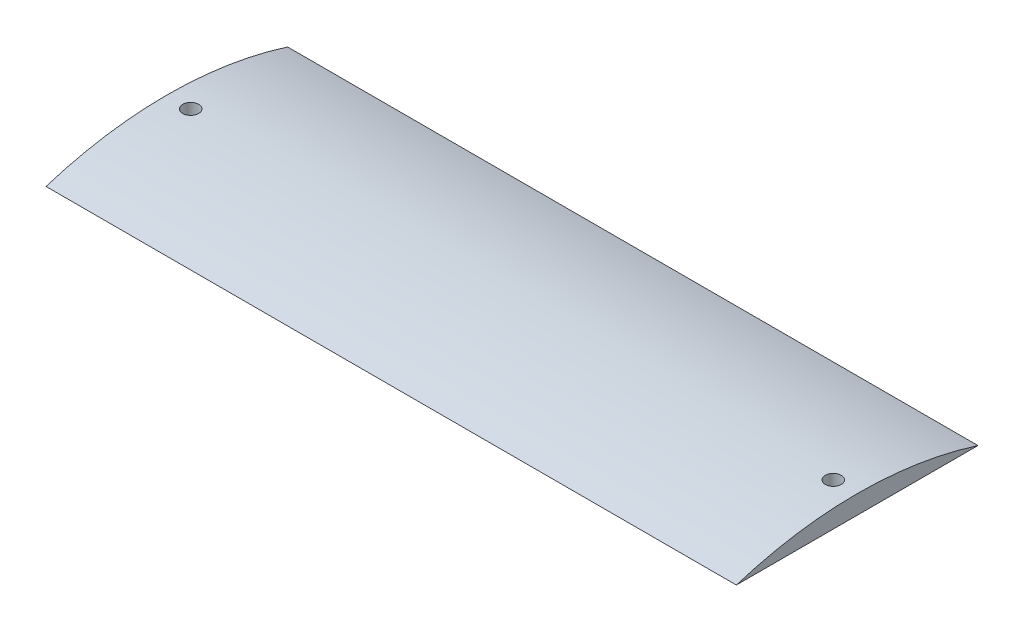
ISO-10303-21;
HEADER;
FILE_DESCRIPTION(('STEP AP214'),'2;1');
FILE_NAME('part.step','',(''),(''),'','','');
FILE_SCHEMA(('AUTOMOTIVE_DESIGN { 1 0 10303 214 1 1 1 1 }'));
ENDSEC;
DATA;
#1=APPLICATION_CONTEXT('core data for automotive mechanical design processes');
#2=APPLICATION_PROTOCOL_DEFINITION('international standard','automotive_design',2000,#1);
#3=PRODUCT_CONTEXT('',#1,'mechanical');
#4=PRODUCT('Part','Part','',(#3));
#5=PRODUCT_RELATED_PRODUCT_CATEGORY('part','',(#4));
#6=PRODUCT_DEFINITION_FORMATION('','',#4);
#7=PRODUCT_DEFINITION_CONTEXT('part definition',#1,'design');
#8=PRODUCT_DEFINITION('design','',#6,#7);
#9=PRODUCT_DEFINITION_SHAPE('','',#8);
#10=(LENGTH_UNIT() NAMED_UNIT(*) SI_UNIT(.MILLI.,.METRE.));
#11=(NAMED_UNIT(*) PLANE_ANGLE_UNIT() SI_UNIT($,.RADIAN.));
#12=(NAMED_UNIT(*) SI_UNIT($,.STERADIAN.) SOLID_ANGLE_UNIT());
#13=UNCERTAINTY_MEASURE_WITH_UNIT(LENGTH_MEASURE(1.E-05),#10,'distance_accuracy_value','');
#14=(GEOMETRIC_REPRESENTATION_CONTEXT(3) GLOBAL_UNCERTAINTY_ASSIGNED_CONTEXT((#13)) GLOBAL_UNIT_ASSIGNED_CONTEXT((#10,
#11,#12)) REPRESENTATION_CONTEXT('',''));
#15=CARTESIAN_POINT('',(0.,0.,0.));
#16=DIRECTION('',(0.,0.,1.));
#17=DIRECTION('',(1.,0.,0.));
#18=AXIS2_PLACEMENT_3D('',#15,#16,#17);
#19=CARTESIAN_POINT('',(130.,-72.4892073790606,0.));
#20=DIRECTION('',(-1.,0.,0.));
#21=DIRECTION('',(0.,0.,1.));
#22=AXIS2_PLACEMENT_3D('',#19,#20,#21);
#23=CYLINDRICAL_SURFACE('',#22,75.02179197864);
#24=CARTESIAN_POINT('',(4.5,2.51758745771623,-1.5));
#25=CARTESIAN_POINT('',(4.41575337688234,2.517587660339,-1.49999626680115));
#26=CARTESIAN_POINT('',(4.33144588133701,2.51773091911916,-1.49287868755343));
#27=CARTESIAN_POINT('',(4.16515338241275,2.51828862515209,-1.46458436839986));
#28=CARTESIAN_POINT('',(4.08317128823804,2.51870339771171,-1.44339076324108));
#29=CARTESIAN_POINT('',(3.923962777628,2.51975712660936,-1.38754852285991));
#30=CARTESIAN_POINT('',(3.84673408606949,2.52039597470163,-1.35290638345535));
#31=CARTESIAN_POINT('',(3.69921019022891,2.52182573029195,-1.27115953649063));
#32=CARTESIAN_POINT('',(3.62891328174617,2.52261660027321,-1.22405790267593));
#33=CARTESIAN_POINT('',(3.49720672335294,2.52426155242362,-1.11871262917422));
#34=CARTESIAN_POINT('',(3.43579911695362,2.52511564905962,-1.06046643464985));
#35=CARTESIAN_POINT('',(3.32363122101918,2.52679065880262,-0.934489101101265));
#36=CARTESIAN_POINT('',(3.27287135221912,2.52761157059733,-0.866757587450125));
#37=CARTESIAN_POINT('',(3.18343953740104,2.52912768871357,-0.723728410526244));
#38=CARTESIAN_POINT('',(3.1447683783982,2.52982288684947,-0.648430255061524));
#39=CARTESIAN_POINT('',(3.0806170223091,2.53100913040255,-0.492408833237885));
#40=CARTESIAN_POINT('',(3.05513678699641,2.53150017641134,-0.4116855826013));
#41=CARTESIAN_POINT('',(3.01809375721797,2.53222270084515,-0.247116779877941));
#42=CARTESIAN_POINT('',(3.00652910340262,2.53245421394772,-0.163271646469624));
#43=CARTESIAN_POINT('',(2.99763980311429,2.5326316891928,0.00517022547672061));
#44=CARTESIAN_POINT('',(3.00031511714151,2.53257765212738,0.0897669619292499));
#45=CARTESIAN_POINT('',(3.01982819225313,2.53219014944421,0.257298022757084));
#46=CARTESIAN_POINT('',(3.03666393260656,2.531856723696,0.340232582600679));
#47=CARTESIAN_POINT('',(3.08401683759285,2.53094807458767,0.502097977749915));
#48=CARTESIAN_POINT('',(3.11453402362798,2.5303728508493,0.581028806792197));
#49=CARTESIAN_POINT('',(3.18838585758707,2.52904537962423,0.732652597846334));
#50=CARTESIAN_POINT('',(3.23172143228286,2.52829311933857,0.805345108336187));
#51=CARTESIAN_POINT('',(3.32997918594778,2.52669637180781,0.94242379082157));
#52=CARTESIAN_POINT('',(3.3849013740753,2.52585188448981,1.00680995625146));
#53=CARTESIAN_POINT('',(3.50478476212505,2.52416570056851,1.12546005396518));
#54=CARTESIAN_POINT('',(3.56974771854444,2.52332400447986,1.17972221151743));
#55=CARTESIAN_POINT('',(3.70786235818385,2.52173844613566,1.2765703101933));
#56=CARTESIAN_POINT('',(3.78101404258098,2.52099458389417,1.31915624963849));
#57=CARTESIAN_POINT('',(3.93343056784684,2.51968857356681,1.39144282443018));
#58=CARTESIAN_POINT('',(4.01269543449796,2.51912642624738,1.42114340542907));
#59=CARTESIAN_POINT('',(4.17508780744006,2.51824726077309,1.46681503227798));
#60=CARTESIAN_POINT('',(4.25821530896129,2.51793024231555,1.48278609508131));
#61=CARTESIAN_POINT('',(4.42595780403811,2.51757713136756,1.50054314884381));
#62=CARTESIAN_POINT('',(4.51057253747874,2.51754099023254,1.50233159606303));
#63=CARTESIAN_POINT('',(4.67890110417302,2.51775358188413,1.49167904839354));
#64=CARTESIAN_POINT('',(4.76261493786747,2.51800231453136,1.47923806046731));
#65=CARTESIAN_POINT('',(4.92675849943482,2.51875656815609,1.44048183431465));
#66=CARTESIAN_POINT('',(5.00718849029876,2.51926206852624,1.41416770949492));
#67=CARTESIAN_POINT('',(5.16248927974445,2.52047285145061,1.34841331452352));
#68=CARTESIAN_POINT('',(5.23736007375231,2.5211781341692,1.30897303357233));
#69=CARTESIAN_POINT('',(5.37942844931379,2.52270908935295,1.21807957209635));
#70=CARTESIAN_POINT('',(5.44662497195909,2.52353477839627,1.16662473675896));
#71=CARTESIAN_POINT('',(5.57142669716998,2.52521340170008,1.05316522193656));
#72=CARTESIAN_POINT('',(5.62903188671369,2.52606633599756,0.991160528128543));
#73=CARTESIAN_POINT('',(5.73302389152463,2.52770343387649,0.85835089401214));
#74=CARTESIAN_POINT('',(5.7794091217747,2.52848758773152,0.787544712474771));
#75=CARTESIAN_POINT('',(5.85963362304942,2.52989858430838,0.639148453903789));
#76=CARTESIAN_POINT('',(5.89347291400547,2.53052542728014,0.561558387647804));
#77=CARTESIAN_POINT('',(5.94764220214536,2.53155108895216,0.401802861739875));
#78=CARTESIAN_POINT('',(5.96797323162748,2.53194992507633,0.319637752231915));
#79=CARTESIAN_POINT('',(5.99455226682792,2.53247467968107,0.153059477505751));
#80=CARTESIAN_POINT('',(6.00080026391399,2.53260059799435,0.0686463109096224));
#81=CARTESIAN_POINT('',(5.99903572365499,2.53256532195803,-0.100015848710095));
#82=CARTESIAN_POINT('',(5.9910256973927,2.532404178165,-0.184264868026863));
#83=CARTESIAN_POINT('',(5.96097762133995,2.53181303989401,-0.350222181574445));
#84=CARTESIAN_POINT('',(5.93893954350867,2.53138304487864,-0.431930470726226));
#85=CARTESIAN_POINT('',(5.88146100445891,2.53030265683223,-0.590488596500193));
#86=CARTESIAN_POINT('',(5.84602030110392,2.52965225981936,-0.667338345317016));
#87=CARTESIAN_POINT('',(5.76274425450957,2.52820439419255,-0.813994667004286));
#88=CARTESIAN_POINT('',(5.71490938085442,2.52740693115091,-0.883801506573807));
#89=CARTESIAN_POINT('',(5.60819868574227,2.52575471328227,-1.0143999872095));
#90=CARTESIAN_POINT('',(5.54932209477499,2.52489995446494,-1.07519099942293));
#91=CARTESIAN_POINT('',(5.4221815706062,2.52322931697357,-1.18604169476186));
#92=CARTESIAN_POINT('',(5.35391531173468,2.52241344799955,-1.23609871136407));
#93=CARTESIAN_POINT('',(5.20991484135045,2.52091239001795,-1.32406441977122));
#94=CARTESIAN_POINT('',(5.13417652033234,2.52022727353664,-1.36196637724751));
#95=CARTESIAN_POINT('',(4.9774692120312,2.51906639966966,-1.42447289077387));
#96=CARTESIAN_POINT('',(4.89650661118949,2.51859039201744,-1.44909335053868));
#97=CARTESIAN_POINT('',(4.76252503394694,2.51802902921586,-1.47779261824422));
#98=CARTESIAN_POINT('',(4.71037623246041,2.51786415593896,-1.48610995532538));
#99=CARTESIAN_POINT('',(4.6054929114471,2.51764330675119,-1.49721481478048));
#100=CARTESIAN_POINT('',(4.55275839199601,2.51758733082625,-1.500002337869));
#101=CARTESIAN_POINT('',(4.5,2.51758745771623,-1.5));
#102=B_SPLINE_CURVE_WITH_KNOTS('',3,(#24,#25,#26,#27,#28,#29,#30,#31,#32,#33,#34,#35,#36,#37,
#38,#39,#40,#41,#42,#43,#44,#45,#46,#47,#48,#49,#50,#51,#52,#53,#54,#55,#56,#57,#58,#59,#60,#61,
#62,#63,#64,#65,#66,#67,#68,#69,#70,#71,#72,#73,#74,#75,#76,#77,#78,#79,#80,#81,#82,#83,#84,#85,
#86,#87,#88,#89,#90,#91,#92,#93,#94,#95,#96,#97,#98,#99,#100,#101),.UNSPECIFIED.,.T.,.F.,(4,2,2,
2,2,2,2,2,2,2,2,2,2,2,2,2,2,2,2,2,2,2,2,2,2,2,2,2,2,2,2,2,2,2,2,2,2,2,4),(0.,0.2525472982516,
0.505397734363843,0.758126192059878,1.01079235993763,1.26351651987831,1.51625066408922,
1.76900125870729,2.0217511208667,2.27446720775324,2.52718259363857,2.77986192247515,
3.03254164658627,3.2852396439547,3.53793784106373,3.79068029445711,4.04342278418197,
4.29616633990868,4.54890958354543,4.80160905410739,5.0543084010235,5.30698747031058,
5.55966674748939,5.81238084774558,6.06509529110172,6.31784541400802,6.57059513537488,
6.82332553944306,7.07605609842334,7.32874215161546,7.58142870990583,7.83411983353783,
8.08680138473308,8.33950055215191,8.59226242218595,8.84516409018663,9.09776224914893,
9.2559168503351,9.41407143108409),.UNSPECIFIED.);
#103=CARTESIAN_POINT('',(4.5,2.51758745771623,-1.5));
#104=VERTEX_POINT('',#103);
#105=EDGE_CURVE('E68',#104,#104,#102,.T.);
#106=ORIENTED_EDGE('',*,*,#105,.F.);
#107=EDGE_LOOP('',(#106));
#108=FACE_BOUND('',#107,.T.);
#109=CARTESIAN_POINT('',(125.5,2.51758745771623,-1.5));
#110=CARTESIAN_POINT('',(125.415753376882,2.517587660339,-1.49999626680115));
#111=CARTESIAN_POINT('',(125.331445881337,2.51773091911916,-1.49287868755343));
#112=CARTESIAN_POINT('',(125.165153382413,2.51828862515209,-1.46458436839986));
#113=CARTESIAN_POINT('',(125.083171288238,2.51870339771171,-1.44339076324108));
#114=CARTESIAN_POINT('',(124.923962777628,2.51975712660936,-1.3875485228599));
#115=CARTESIAN_POINT('',(124.846734086069,2.52039597470163,-1.35290638345534));
#116=CARTESIAN_POINT('',(124.699210190229,2.52182573029195,-1.27115953649062));
#117=CARTESIAN_POINT('',(124.628913281746,2.52261660027321,-1.22405790267591));
#118=CARTESIAN_POINT('',(124.497206723353,2.52426155242362,-1.1187126291742));
#119=CARTESIAN_POINT('',(124.435799116954,2.52511564905962,-1.06046643464983));
#120=CARTESIAN_POINT('',(124.323631221019,2.52679065880262,-0.934489101101245));
#121=CARTESIAN_POINT('',(124.272871352219,2.52761157059733,-0.866757587450107));
#122=CARTESIAN_POINT('',(124.183439537401,2.52912768871357,-0.723728410526223));
#123=CARTESIAN_POINT('',(124.144768378398,2.52982288684947,-0.648430255061501));
#124=CARTESIAN_POINT('',(124.080617022309,2.53100913040255,-0.492408833237859));
#125=CARTESIAN_POINT('',(124.055136786996,2.53150017641134,-0.411685582601275));
#126=CARTESIAN_POINT('',(124.018093757218,2.53222270084515,-0.247116779877915));
#127=CARTESIAN_POINT('',(124.006529103403,2.53245421394772,-0.163271646469597));
#128=CARTESIAN_POINT('',(123.997639803114,2.5326316891928,0.00517022547674901));
#129=CARTESIAN_POINT('',(124.000315117141,2.53257765212738,0.0897669619292782));
#130=CARTESIAN_POINT('',(124.019828192253,2.53219014944421,0.257298022757111));
#131=CARTESIAN_POINT('',(124.036663932607,2.531856723696,0.340232582600704));
#132=CARTESIAN_POINT('',(124.084016837593,2.53094807458767,0.502097977749942));
#133=CARTESIAN_POINT('',(124.114534023628,2.5303728508493,0.581028806792225));
#134=CARTESIAN_POINT('',(124.188385857587,2.52904537962423,0.732652597846358));
#135=CARTESIAN_POINT('',(124.231721432283,2.52829311933857,0.805345108336206));
#136=CARTESIAN_POINT('',(124.329979185948,2.52669637180781,0.94242379082159));
#137=CARTESIAN_POINT('',(124.384901374075,2.52585188448981,1.00680995625148));
#138=CARTESIAN_POINT('',(124.504784762125,2.52416570056851,1.12546005396521));
#139=CARTESIAN_POINT('',(124.569747718544,2.52332400447986,1.17972221151745));
#140=CARTESIAN_POINT('',(124.707862358184,2.52173844613566,1.27657031019333));
#141=CARTESIAN_POINT('',(124.781014042581,2.52099458389417,1.31915624963852));
#142=CARTESIAN_POINT('',(124.933430567847,2.51968857356681,1.39144282443021));
#143=CARTESIAN_POINT('',(125.012695434498,2.51912642624738,1.42114340542909));
#144=CARTESIAN_POINT('',(125.17508780744,2.51824726077309,1.46681503227801));
#145=CARTESIAN_POINT('',(125.258215308961,2.51793024231555,1.48278609508134));
#146=CARTESIAN_POINT('',(125.425957804038,2.51757713136756,1.50054314884384));
#147=CARTESIAN_POINT('',(125.510572537479,2.51754099023254,1.50233159606305));
#148=CARTESIAN_POINT('',(125.678901104173,2.51775358188413,1.49167904839356));
#149=CARTESIAN_POINT('',(125.762614937867,2.51800231453136,1.47923806046733));
#150=CARTESIAN_POINT('',(125.926758499435,2.51875656815609,1.44048183431467));
#151=CARTESIAN_POINT('',(126.007188490299,2.51926206852624,1.41416770949494));
#152=CARTESIAN_POINT('',(126.162489279744,2.52047285145061,1.34841331452354));
#153=CARTESIAN_POINT('',(126.237360073752,2.52117813416919,1.30897303357236));
#154=CARTESIAN_POINT('',(126.379428449314,2.52270908935295,1.21807957209638));
#155=CARTESIAN_POINT('',(126.446624971959,2.52353477839627,1.16662473675899));
#156=CARTESIAN_POINT('',(126.57142669717,2.52521340170008,1.05316522193658));
#157=CARTESIAN_POINT('',(126.629031886714,2.52606633599756,0.991160528128558));
#158=CARTESIAN_POINT('',(126.733023891525,2.52770343387649,0.85835089401215));
#159=CARTESIAN_POINT('',(126.779409121775,2.52848758773152,0.787544712474784));
#160=CARTESIAN_POINT('',(126.859633623049,2.52989858430838,0.639148453903804));
#161=CARTESIAN_POINT('',(126.893472914005,2.53052542728014,0.561558387647819));
#162=CARTESIAN_POINT('',(126.947642202145,2.53155108895216,0.401802861739888));
#163=CARTESIAN_POINT('',(126.967973231627,2.53194992507633,0.319637752231926));
#164=CARTESIAN_POINT('',(126.994552266828,2.53247467968107,0.153059477505757));
#165=CARTESIAN_POINT('',(127.000800263914,2.53260059799435,0.0686463109096274));
#166=CARTESIAN_POINT('',(126.999035723655,2.53256532195803,-0.100015848710093));
#167=CARTESIAN_POINT('',(126.991025697393,2.532404178165,-0.184264868026861));
#168=CARTESIAN_POINT('',(126.96097762134,2.53181303989401,-0.350222181574443));
#169=CARTESIAN_POINT('',(126.938939543509,2.53138304487864,-0.431930470726224));
#170=CARTESIAN_POINT('',(126.881461004459,2.53030265683223,-0.590488596500191));
#171=CARTESIAN_POINT('',(126.846020301104,2.52965225981936,-0.667338345317015));
#172=CARTESIAN_POINT('',(126.76274425451,2.52820439419255,-0.813994667004287));
#173=CARTESIAN_POINT('',(126.714909380854,2.52740693115091,-0.883801506573809));
#174=CARTESIAN_POINT('',(126.608198685742,2.52575471328227,-1.0143999872095));
#175=CARTESIAN_POINT('',(126.549322094775,2.52489995446494,-1.07519099942293));
#176=CARTESIAN_POINT('',(126.422181570606,2.52322931697357,-1.18604169476186));
#177=CARTESIAN_POINT('',(126.353915311735,2.52241344799955,-1.23609871136407));
#178=CARTESIAN_POINT('',(126.20991484135,2.52091239001795,-1.32406441977121));
#179=CARTESIAN_POINT('',(126.134176520332,2.52022727353664,-1.36196637724751));
#180=CARTESIAN_POINT('',(125.977469212031,2.51906639966966,-1.42447289077387));
#181=CARTESIAN_POINT('',(125.896506611189,2.51859039201744,-1.44909335053868));
#182=CARTESIAN_POINT('',(125.762525033947,2.51802902921586,-1.47779261824422));
#183=CARTESIAN_POINT('',(125.71037623246,2.51786415593896,-1.48610995532538));
#184=CARTESIAN_POINT('',(125.605492911447,2.51764330675119,-1.49721481478047));
#185=CARTESIAN_POINT('',(125.552758391996,2.51758733082625,-1.50000233786899));
#186=CARTESIAN_POINT('',(125.5,2.51758745771623,-1.5));
#187=B_SPLINE_CURVE_WITH_KNOTS('',3,(#109,#110,#111,#112,#113,#114,#115,#116,#117,#118,#119,
#120,#121,#122,#123,#124,#125,#126,#127,#128,#129,#130,#131,#132,#133,#134,#135,#136,#137,#138,
#139,#140,#141,#142,#143,#144,#145,#146,#147,#148,#149,#150,#151,#152,#153,#154,#155,#156,#157,
#158,#159,#160,#161,#162,#163,#164,#165,#166,#167,#168,#169,#170,#171,#172,#173,#174,#175,#176,
#177,#178,#179,#180,#181,#182,#183,#184,#185,#186),.UNSPECIFIED.,.T.,.F.,(4,2,2,2,2,2,2,2,2,2,2,
2,2,2,2,2,2,2,2,2,2,2,2,2,2,2,2,2,2,2,2,2,2,2,2,2,2,2,4),(0.,0.252547298251628,
0.505397734363854,0.758126192059889,1.01079235993766,1.26351651987833,1.51625066408924,
1.76900125870732,2.02175112086673,2.27446720775327,2.5271825936386,2.77986192247518,
3.0325416465863,3.28523964395472,3.53793784106377,3.79068029445714,4.04342278418201,
4.29616633990871,4.54890958354546,4.80160905410745,5.05430840102356,5.30698747031064,
5.55966674748941,5.81238084774561,6.06509529110178,6.31784541400807,6.57059513537493,
6.82332553944312,7.0760560984234,7.32874215161552,7.5814287099059,7.8341198335379,
8.08680138473315,8.33950055215198,8.59226242218603,8.84516409018672,9.09776224914902,
9.25591685033521,9.41407143108416),.UNSPECIFIED.);
#188=CARTESIAN_POINT('',(125.5,2.51758745771623,-1.5));
#189=VERTEX_POINT('',#188);
#190=EDGE_CURVE('E76',#189,#189,#187,.T.);
#191=ORIENTED_EDGE('',*,*,#190,.F.);
#192=EDGE_LOOP('',(#191));
#193=FACE_BOUND('',#192,.T.);
#194=CARTESIAN_POINT('',(0.,-72.4892073790606,0.));
#195=DIRECTION('',(1.,0.,0.));
#196=DIRECTION('',(0.,0.,1.));
#197=AXIS2_PLACEMENT_3D('',#194,#195,#196);
#198=CIRCLE('',#197,75.02179197864);
#199=CARTESIAN_POINT('',(0.,-1.,-22.75));
#200=VERTEX_POINT('',#199);
#201=CARTESIAN_POINT('',(0.,-1.,22.75));
#202=VERTEX_POINT('',#201);
#203=EDGE_CURVE('E64',#200,#202,#198,.T.);
#204=ORIENTED_EDGE('',*,*,#203,.T.);
#205=DIRECTION('',(-1.,0.,0.));
#206=VECTOR('',#205,1.);
#207=CARTESIAN_POINT('',(130.,-1.,22.75));
#208=LINE('',#207,#206);
#209=CARTESIAN_POINT('',(130.,-1.,22.75));
#210=VERTEX_POINT('',#209);
#211=EDGE_CURVE('E11',#210,#202,#208,.T.);
#212=ORIENTED_EDGE('',*,*,#211,.F.);
#213=CARTESIAN_POINT('',(130.,-72.4892073790606,0.));
#214=DIRECTION('',(1.,0.,0.));
#215=DIRECTION('',(0.,0.,1.));
#216=AXIS2_PLACEMENT_3D('',#213,#214,#215);
#217=CIRCLE('',#216,75.02179197864);
#218=CARTESIAN_POINT('',(130.,-1.,-22.75));
#219=VERTEX_POINT('',#218);
#220=EDGE_CURVE('E63',#219,#210,#217,.T.);
#221=ORIENTED_EDGE('',*,*,#220,.F.);
#222=DIRECTION('',(-1.,0.,0.));
#223=VECTOR('',#222,1.);
#224=CARTESIAN_POINT('',(130.,-1.,-22.75));
#225=LINE('',#224,#223);
#226=EDGE_CURVE('E41',#219,#200,#225,.T.);
#227=ORIENTED_EDGE('',*,*,#226,.T.);
#228=EDGE_LOOP('',(#204,#212,#221,#227));
#229=FACE_BOUND('',#228,.T.);
#230=ADVANCED_FACE('F33',(#108,#193,#229),#23,.T.);
#231=CARTESIAN_POINT('',(130.,-1.,22.75));
#232=DIRECTION('',(0.,1.,0.));
#233=DIRECTION('',(0.,0.,1.));
#234=AXIS2_PLACEMENT_3D('',#231,#232,#233);
#235=PLANE('',#234);
#236=CARTESIAN_POINT('',(4.5,-1.,0.));
#237=DIRECTION('',(0.,-1.,0.));
#238=DIRECTION('',(0.,0.,-1.));
#239=AXIS2_PLACEMENT_3D('',#236,#237,#238);
#240=CIRCLE('',#239,1.5);
#241=CARTESIAN_POINT('',(4.5,-1.,-1.5));
#242=VERTEX_POINT('',#241);
#243=EDGE_CURVE('E71',#242,#242,#240,.T.);
#244=ORIENTED_EDGE('',*,*,#243,.F.);
#245=EDGE_LOOP('',(#244));
#246=FACE_BOUND('',#245,.T.);
#247=CARTESIAN_POINT('',(125.5,-1.,0.));
#248=DIRECTION('',(0.,-1.,0.));
#249=DIRECTION('',(0.,0.,1.));
#250=AXIS2_PLACEMENT_3D('',#247,#248,#249);
#251=CIRCLE('',#250,1.50000000000001);
#252=CARTESIAN_POINT('',(125.5,-1.,1.50000000000003));
#253=VERTEX_POINT('',#252);
#254=EDGE_CURVE('E83',#253,#253,#251,.T.);
#255=ORIENTED_EDGE('',*,*,#254,.F.);
#256=EDGE_LOOP('',(#255));
#257=FACE_BOUND('',#256,.T.);
#258=DIRECTION('',(0.,0.,-1.));
#259=VECTOR('',#258,1.);
#260=CARTESIAN_POINT('',(0.,-1.,22.75));
#261=LINE('',#260,#259);
#262=EDGE_CURVE('E56',#202,#200,#261,.T.);
#263=ORIENTED_EDGE('',*,*,#262,.T.);
#264=ORIENTED_EDGE('',*,*,#226,.F.);
#265=DIRECTION('',(0.,0.,-1.));
#266=VECTOR('',#265,1.);
#267=CARTESIAN_POINT('',(130.,-1.,22.75));
#268=LINE('',#267,#266);
#269=EDGE_CURVE('E48',#210,#219,#268,.T.);
#270=ORIENTED_EDGE('',*,*,#269,.F.);
#271=ORIENTED_EDGE('',*,*,#211,.T.);
#272=EDGE_LOOP('',(#263,#264,#270,#271));
#273=FACE_BOUND('',#272,.T.);
#274=ADVANCED_FACE('F59',(#246,#257,#273),#235,.F.);
#275=CARTESIAN_POINT('',(130.,-72.4892073790606,0.));
#276=DIRECTION('',(-1.,0.,0.));
#277=DIRECTION('',(0.,0.,1.));
#278=AXIS2_PLACEMENT_3D('',#275,#276,#277);
#279=PLANE('',#278);
#280=ORIENTED_EDGE('',*,*,#220,.T.);
#281=ORIENTED_EDGE('',*,*,#269,.T.);
#282=EDGE_LOOP('',(#280,#281));
#283=FACE_BOUND('',#282,.T.);
#284=ADVANCED_FACE('F104',(#283),#279,.F.);
#285=CARTESIAN_POINT('',(0.,-72.4892073790606,0.));
#286=DIRECTION('',(-1.,0.,0.));
#287=DIRECTION('',(0.,0.,1.));
#288=AXIS2_PLACEMENT_3D('',#285,#286,#287);
#289=PLANE('',#288);
#290=ORIENTED_EDGE('',*,*,#203,.F.);
#291=ORIENTED_EDGE('',*,*,#262,.F.);
#292=EDGE_LOOP('',(#290,#291));
#293=FACE_BOUND('',#292,.T.);
#294=ADVANCED_FACE('F67',(#293),#289,.T.);
#295=CARTESIAN_POINT('',(125.5,2.53358459957939,0.));
#296=DIRECTION('',(0.,-1.,0.));
#297=DIRECTION('',(0.,0.,-1.));
#298=AXIS2_PLACEMENT_3D('',#295,#296,#297);
#299=CYLINDRICAL_SURFACE('',#298,1.50000000000001);
#300=ORIENTED_EDGE('',*,*,#254,.T.);
#301=EDGE_LOOP('',(#300));
#302=FACE_BOUND('',#301,.T.);
#303=ORIENTED_EDGE('',*,*,#190,.T.);
#304=EDGE_LOOP('',(#303));
#305=FACE_BOUND('',#304,.T.);
#306=ADVANCED_FACE('F84',(#302,#305),#299,.F.);
#307=CARTESIAN_POINT('',(4.5,2.53358459957939,0.));
#308=DIRECTION('',(0.,-1.,0.));
#309=DIRECTION('',(0.,0.,-1.));
#310=AXIS2_PLACEMENT_3D('',#307,#308,#309);
#311=CYLINDRICAL_SURFACE('',#310,1.5);
#312=ORIENTED_EDGE('',*,*,#243,.T.);
#313=EDGE_LOOP('',(#312));
#314=FACE_BOUND('',#313,.T.);
#315=ORIENTED_EDGE('',*,*,#105,.T.);
#316=EDGE_LOOP('',(#315));
#317=FACE_BOUND('',#316,.T.);
#318=ADVANCED_FACE('F89',(#314,#317),#311,.F.);
#319=CLOSED_SHELL('',(#230,#274,#284,#294,#306,#318));
#320=MANIFOLD_SOLID_BREP('B2',#319);
#321=ADVANCED_BREP_SHAPE_REPRESENTATION('',(#18,#320),#14);
#322=SHAPE_DEFINITION_REPRESENTATION(#9,#321);
ENDSEC;
END-ISO-10303-21;
